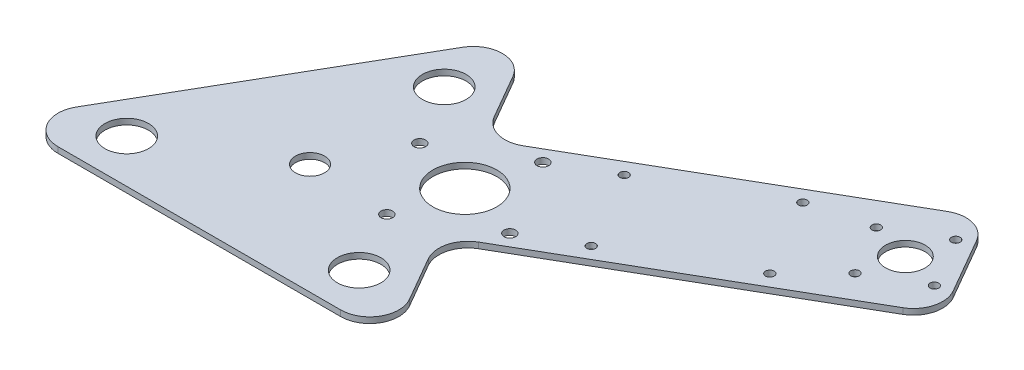
ISO-10303-21;
HEADER;
FILE_DESCRIPTION(('STEP AP214'),'2;1');
FILE_NAME('part.step','',(''),(''),'','','');
FILE_SCHEMA(('AUTOMOTIVE_DESIGN { 1 0 10303 214 1 1 1 1 }'));
ENDSEC;
DATA;
#1=APPLICATION_CONTEXT('core data for automotive mechanical design processes');
#2=APPLICATION_PROTOCOL_DEFINITION('international standard','automotive_design',2000,#1);
#3=PRODUCT_CONTEXT('',#1,'mechanical');
#4=PRODUCT('Part','Part','',(#3));
#5=PRODUCT_RELATED_PRODUCT_CATEGORY('part','',(#4));
#6=PRODUCT_DEFINITION_FORMATION('','',#4);
#7=PRODUCT_DEFINITION_CONTEXT('part definition',#1,'design');
#8=PRODUCT_DEFINITION('design','',#6,#7);
#9=PRODUCT_DEFINITION_SHAPE('','',#8);
#10=(LENGTH_UNIT() NAMED_UNIT(*) SI_UNIT(.MILLI.,.METRE.));
#11=(NAMED_UNIT(*) PLANE_ANGLE_UNIT() SI_UNIT($,.RADIAN.));
#12=(NAMED_UNIT(*) SI_UNIT($,.STERADIAN.) SOLID_ANGLE_UNIT());
#13=UNCERTAINTY_MEASURE_WITH_UNIT(LENGTH_MEASURE(1.E-05),#10,'distance_accuracy_value','');
#14=(GEOMETRIC_REPRESENTATION_CONTEXT(3) GLOBAL_UNCERTAINTY_ASSIGNED_CONTEXT((#13)) GLOBAL_UNIT_ASSIGNED_CONTEXT((#10,
#11,#12)) REPRESENTATION_CONTEXT('',''));
#15=CARTESIAN_POINT('',(0.,0.,0.));
#16=DIRECTION('',(0.,0.,1.));
#17=DIRECTION('',(1.,0.,0.));
#18=AXIS2_PLACEMENT_3D('',#15,#16,#17);
#19=CARTESIAN_POINT('',(65.9807621135332,2.,38.0940107675853));
#20=DIRECTION('',(-0.866025403784439,0.,0.5));
#21=DIRECTION('',(0.5,0.,0.866025403784439));
#22=AXIS2_PLACEMENT_3D('',#19,#20,#21);
#23=PLANE('',#22);
#24=DIRECTION('',(-0.5,0.,-0.866025403784439));
#25=VECTOR('',#24,1.);
#26=CARTESIAN_POINT('',(65.9807621135332,2.,38.0940107675853));
#27=LINE('',#26,#25);
#28=CARTESIAN_POINT('',(17.4903810567665,2.,-45.8937929011101));
#29=VERTEX_POINT('',#28);
#30=CARTESIAN_POINT('',(8.66025403784439,2.,-61.1880215351698));
#31=VERTEX_POINT('',#30);
#32=EDGE_CURVE('E200',#29,#31,#27,.T.);
#33=ORIENTED_EDGE('',*,*,#32,.F.);
#34=DIRECTION('',(0.,1.,0.));
#35=VECTOR('',#34,1.);
#36=CARTESIAN_POINT('',(17.4903810567665,2.,-45.89379290111));
#37=LINE('',#36,#35);
#38=CARTESIAN_POINT('',(17.4903810567665,0.,-45.8937929011101));
#39=VERTEX_POINT('',#38);
#40=EDGE_CURVE('E220',#29,#39,#37,.F.);
#41=ORIENTED_EDGE('',*,*,#40,.T.);
#42=DIRECTION('',(-0.5,0.,-0.866025403784439));
#43=VECTOR('',#42,1.);
#44=CARTESIAN_POINT('',(65.9807621135332,0.,38.0940107675853));
#45=LINE('',#44,#43);
#46=CARTESIAN_POINT('',(8.66025403784439,0.,-61.1880215351698));
#47=VERTEX_POINT('',#46);
#48=EDGE_CURVE('E189',#39,#47,#45,.T.);
#49=ORIENTED_EDGE('',*,*,#48,.T.);
#50=DIRECTION('',(0.,-1.,0.));
#51=VECTOR('',#50,1.);
#52=CARTESIAN_POINT('',(8.66025403784439,2.,-61.1880215351698));
#53=LINE('',#52,#51);
#54=EDGE_CURVE('E426',#47,#31,#53,.F.);
#55=ORIENTED_EDGE('',*,*,#54,.T.);
#56=EDGE_LOOP('',(#33,#41,#49,#55));
#57=FACE_BOUND('',#56,.T.);
#58=ADVANCED_FACE('F35',(#57),#23,.F.);
#59=CARTESIAN_POINT('',(0.,2.,0.));
#60=DIRECTION('',(0.,1.,0.));
#61=DIRECTION('',(0.,0.,1.));
#62=AXIS2_PLACEMENT_3D('',#59,#60,#61);
#63=PLANE('',#62);
#64=CARTESIAN_POINT('',(72.7019052838329,2.,-24.0766062413412));
#65=DIRECTION('',(0.,1.,0.));
#66=DIRECTION('',(0.,0.,1.));
#67=AXIS2_PLACEMENT_3D('',#64,#65,#66);
#68=CIRCLE('',#67,1.5);
#69=CARTESIAN_POINT('',(72.7019052838329,2.,-22.5766062413412));
#70=VERTEX_POINT('',#69);
#71=EDGE_CURVE('E248',#70,#70,#68,.T.);
#72=ORIENTED_EDGE('',*,*,#71,.F.);
#73=EDGE_LOOP('',(#72));
#74=FACE_BOUND('',#73,.T.);
#75=CARTESIAN_POINT('',(111.673048454133,2.,-46.5766062413412));
#76=DIRECTION('',(0.,1.,0.));
#77=DIRECTION('',(0.,0.,1.));
#78=AXIS2_PLACEMENT_3D('',#75,#76,#77);
#79=CIRCLE('',#78,1.5);
#80=CARTESIAN_POINT('',(111.673048454133,2.,-45.0766062413412));
#81=VERTEX_POINT('',#80);
#82=EDGE_CURVE('E556',#81,#81,#79,.T.);
#83=ORIENTED_EDGE('',*,*,#82,.F.);
#84=EDGE_LOOP('',(#83));
#85=FACE_BOUND('',#84,.T.);
#86=CARTESIAN_POINT('',(96.1730484541327,2.,-73.4233937586588));
#87=DIRECTION('',(0.,1.,0.));
#88=DIRECTION('',(0.,0.,1.));
#89=AXIS2_PLACEMENT_3D('',#86,#87,#88);
#90=CIRCLE('',#89,1.5);
#91=CARTESIAN_POINT('',(96.1730484541327,2.,-71.9233937586588));
#92=VERTEX_POINT('',#91);
#93=EDGE_CURVE('E262',#92,#92,#90,.T.);
#94=ORIENTED_EDGE('',*,*,#93,.F.);
#95=EDGE_LOOP('',(#94));
#96=FACE_BOUND('',#95,.T.);
#97=CARTESIAN_POINT('',(57.2019052838329,2.,-50.9233937586588));
#98=DIRECTION('',(0.,1.,0.));
#99=DIRECTION('',(0.,0.,1.));
#100=AXIS2_PLACEMENT_3D('',#97,#98,#99);
#101=CIRCLE('',#100,1.5);
#102=CARTESIAN_POINT('',(57.2019052838329,2.,-49.4233937586588));
#103=VERTEX_POINT('',#102);
#104=EDGE_CURVE('E244',#103,#103,#101,.T.);
#105=ORIENTED_EDGE('',*,*,#104,.F.);
#106=EDGE_LOOP('',(#105));
#107=FACE_BOUND('',#106,.T.);
#108=CARTESIAN_POINT('',(143.56406460551,2.,-71.3397459621556));
#109=DIRECTION('',(0.,1.,0.));
#110=DIRECTION('',(0.,0.,1.));
#111=AXIS2_PLACEMENT_3D('',#108,#109,#110);
#112=CIRCLE('',#111,1.5);
#113=CARTESIAN_POINT('',(143.56406460551,2.,-69.8397459621556));
#114=VERTEX_POINT('',#113);
#115=EDGE_CURVE('E274',#114,#114,#112,.T.);
#116=ORIENTED_EDGE('',*,*,#115,.F.);
#117=EDGE_LOOP('',(#116));
#118=FACE_BOUND('',#117,.T.);
#119=CARTESIAN_POINT('',(126.243556529821,2.,-61.3397459621556));
#120=DIRECTION('',(0.,1.,0.));
#121=DIRECTION('',(0.,0.,1.));
#122=AXIS2_PLACEMENT_3D('',#119,#120,#121);
#123=CIRCLE('',#122,1.5);
#124=CARTESIAN_POINT('',(126.243556529821,2.,-59.8397459621556));
#125=VERTEX_POINT('',#124);
#126=EDGE_CURVE('E280',#125,#125,#123,.T.);
#127=ORIENTED_EDGE('',*,*,#126,.F.);
#128=EDGE_LOOP('',(#127));
#129=FACE_BOUND('',#128,.T.);
#130=CARTESIAN_POINT('',(116.243556529821,2.,-78.6602540378444));
#131=DIRECTION('',(0.,1.,0.));
#132=DIRECTION('',(0.,0.,1.));
#133=AXIS2_PLACEMENT_3D('',#130,#131,#132);
#134=CIRCLE('',#133,1.5);
#135=CARTESIAN_POINT('',(116.243556529821,2.,-77.1602540378444));
#136=VERTEX_POINT('',#135);
#137=EDGE_CURVE('E243',#136,#136,#134,.T.);
#138=ORIENTED_EDGE('',*,*,#137,.F.);
#139=EDGE_LOOP('',(#138));
#140=FACE_BOUND('',#139,.T.);
#141=CARTESIAN_POINT('',(133.56406460551,2.,-88.6602540378444));
#142=DIRECTION('',(0.,1.,0.));
#143=DIRECTION('',(0.,0.,1.));
#144=AXIS2_PLACEMENT_3D('',#141,#142,#143);
#145=CIRCLE('',#144,1.5);
#146=CARTESIAN_POINT('',(133.56406460551,2.,-87.1602540378444));
#147=VERTEX_POINT('',#146);
#148=EDGE_CURVE('E296',#147,#147,#145,.T.);
#149=ORIENTED_EDGE('',*,*,#148,.F.);
#150=EDGE_LOOP('',(#149));
#151=FACE_BOUND('',#150,.T.);
#152=CARTESIAN_POINT('',(129.903810567666,2.,-75.));
#153=DIRECTION('',(0.,1.,0.));
#154=DIRECTION('',(0.,0.,1.));
#155=AXIS2_PLACEMENT_3D('',#152,#153,#154);
#156=CIRCLE('',#155,6.8);
#157=CARTESIAN_POINT('',(129.903810567666,2.,-68.2));
#158=VERTEX_POINT('',#157);
#159=EDGE_CURVE('E239',#158,#158,#156,.T.);
#160=ORIENTED_EDGE('',*,*,#159,.F.);
#161=EDGE_LOOP('',(#160));
#162=FACE_BOUND('',#161,.T.);
#163=CARTESIAN_POINT('',(39.4483845062519,2.,-40.6733937586588));
#164=DIRECTION('',(0.,1.,0.));
#165=DIRECTION('',(0.,0.,1.));
#166=AXIS2_PLACEMENT_3D('',#163,#164,#165);
#167=CIRCLE('',#166,2.);
#168=CARTESIAN_POINT('',(39.4483845062519,2.,-38.6733937586588));
#169=VERTEX_POINT('',#168);
#170=EDGE_CURVE('E306',#169,#169,#167,.T.);
#171=ORIENTED_EDGE('',*,*,#170,.F.);
#172=EDGE_LOOP('',(#171));
#173=FACE_BOUND('',#172,.T.);
#174=CARTESIAN_POINT('',(54.9483845062519,2.,-13.8266062413412));
#175=DIRECTION('',(0.,1.,0.));
#176=DIRECTION('',(0.,0.,1.));
#177=AXIS2_PLACEMENT_3D('',#174,#175,#176);
#178=CIRCLE('',#177,2.);
#179=CARTESIAN_POINT('',(54.9483845062519,2.,-11.8266062413412));
#180=VERTEX_POINT('',#179);
#181=EDGE_CURVE('E316',#180,#180,#178,.T.);
#182=ORIENTED_EDGE('',*,*,#181,.F.);
#183=EDGE_LOOP('',(#182));
#184=FACE_BOUND('',#183,.T.);
#185=CARTESIAN_POINT('',(28.1015969889343,2.,1.67339375865881));
#186=DIRECTION('',(0.,1.,0.));
#187=DIRECTION('',(0.,0.,1.));
#188=AXIS2_PLACEMENT_3D('',#185,#186,#187);
#189=CIRCLE('',#188,2.);
#190=CARTESIAN_POINT('',(28.1015969889343,2.,3.67339375865881));
#191=VERTEX_POINT('',#190);
#192=EDGE_CURVE('E322',#191,#191,#189,.T.);
#193=ORIENTED_EDGE('',*,*,#192,.F.);
#194=EDGE_LOOP('',(#193));
#195=FACE_BOUND('',#194,.T.);
#196=CARTESIAN_POINT('',(12.6015969889343,2.,-25.1733937586588));
#197=DIRECTION('',(0.,1.,0.));
#198=DIRECTION('',(0.,0.,1.));
#199=AXIS2_PLACEMENT_3D('',#196,#197,#198);
#200=CIRCLE('',#199,2.);
#201=CARTESIAN_POINT('',(12.6015969889343,2.,-23.1733937586588));
#202=VERTEX_POINT('',#201);
#203=EDGE_CURVE('E238',#202,#202,#200,.T.);
#204=ORIENTED_EDGE('',*,*,#203,.F.);
#205=EDGE_LOOP('',(#204));
#206=FACE_BOUND('',#205,.T.);
#207=CARTESIAN_POINT('',(33.7749907475931,2.,-19.5));
#208=DIRECTION('',(0.,1.,0.));
#209=DIRECTION('',(0.,0.,1.));
#210=AXIS2_PLACEMENT_3D('',#207,#208,#209);
#211=CIRCLE('',#210,11.);
#212=CARTESIAN_POINT('',(33.7749907475931,2.,-8.49999999999999));
#213=VERTEX_POINT('',#212);
#214=EDGE_CURVE('E305',#213,#213,#211,.T.);
#215=ORIENTED_EDGE('',*,*,#214,.F.);
#216=EDGE_LOOP('',(#215));
#217=FACE_BOUND('',#216,.T.);
#218=CARTESIAN_POINT('',(40.,2.,23.0940107675853));
#219=DIRECTION('',(0.,1.,0.));
#220=DIRECTION('',(0.,0.,1.));
#221=AXIS2_PLACEMENT_3D('',#218,#219,#220);
#222=CIRCLE('',#221,7.5);
#223=CARTESIAN_POINT('',(40.,2.,30.5940107675853));
#224=VERTEX_POINT('',#223);
#225=EDGE_CURVE('E374',#224,#224,#222,.T.);
#226=ORIENTED_EDGE('',*,*,#225,.F.);
#227=EDGE_LOOP('',(#226));
#228=FACE_BOUND('',#227,.T.);
#229=CARTESIAN_POINT('',(0.,2.,-46.1880215351698));
#230=DIRECTION('',(0.,1.,0.));
#231=DIRECTION('',(0.,0.,1.));
#232=AXIS2_PLACEMENT_3D('',#229,#230,#231);
#233=CIRCLE('',#232,7.5);
#234=CARTESIAN_POINT('',(0.,2.,-38.6880215351698));
#235=VERTEX_POINT('',#234);
#236=EDGE_CURVE('E192',#235,#235,#233,.T.);
#237=ORIENTED_EDGE('',*,*,#236,.F.);
#238=EDGE_LOOP('',(#237));
#239=FACE_BOUND('',#238,.T.);
#240=DIRECTION('',(-0.5,0.,-0.866025403784438));
#241=VECTOR('',#240,1.);
#242=CARTESIAN_POINT('',(153.394191624432,2.,-64.3134665205268));
#243=LINE('',#242,#241);
#244=CARTESIAN_POINT('',(148.394191624432,2.,-72.9737205583712));
#245=VERTEX_POINT('',#244);
#246=CARTESIAN_POINT('',(137.394191624432,2.,-92.0262794416288));
#247=VERTEX_POINT('',#246);
#248=EDGE_CURVE('E143',#245,#247,#243,.T.);
#249=ORIENTED_EDGE('',*,*,#248,.T.);
#250=CARTESIAN_POINT('',(128.733937586588,2.,-87.0262794416289));
#251=DIRECTION('',(0.,1.,0.));
#252=DIRECTION('',(0.,0.,1.));
#253=AXIS2_PLACEMENT_3D('',#250,#251,#252);
#254=CIRCLE('',#253,10.);
#255=CARTESIAN_POINT('',(123.733937586588,2.,-95.6865334794733));
#256=VERTEX_POINT('',#255);
#257=EDGE_CURVE('E149',#247,#256,#254,.T.);
#258=ORIENTED_EDGE('',*,*,#257,.T.);
#259=DIRECTION('',(-0.866025403784439,0.,0.5));
#260=VECTOR('',#259,1.);
#261=CARTESIAN_POINT('',(22.4903810567665,2.,-37.2335388632657));
#262=LINE('',#261,#260);
#263=CARTESIAN_POINT('',(31.1506350946109,2.,-42.2335388632657));
#264=VERTEX_POINT('',#263);
#265=EDGE_CURVE('E159',#256,#264,#262,.T.);
#266=ORIENTED_EDGE('',*,*,#265,.T.);
#267=CARTESIAN_POINT('',(26.1506350946109,2.,-50.89379290111));
#268=DIRECTION('',(0.,1.,0.));
#269=DIRECTION('',(0.,0.,1.));
#270=AXIS2_PLACEMENT_3D('',#267,#268,#269);
#271=CIRCLE('',#270,10.);
#272=EDGE_CURVE('E230',#264,#29,#271,.F.);
#273=ORIENTED_EDGE('',*,*,#272,.T.);
#274=ORIENTED_EDGE('',*,*,#32,.T.);
#275=CARTESIAN_POINT('',(0.,2.,-56.1880215351698));
#276=DIRECTION('',(0.,1.,0.));
#277=DIRECTION('',(0.,0.,1.));
#278=AXIS2_PLACEMENT_3D('',#275,#276,#277);
#279=CIRCLE('',#278,10.);
#280=CARTESIAN_POINT('',(-8.66025403784439,2.,-61.1880215351698));
#281=VERTEX_POINT('',#280);
#282=EDGE_CURVE('E150',#31,#281,#279,.T.);
#283=ORIENTED_EDGE('',*,*,#282,.T.);
#284=DIRECTION('',(-0.5,0.,0.866025403784439));
#285=VECTOR('',#284,1.);
#286=CARTESIAN_POINT('',(0.,2.,-76.1880215351698));
#287=LINE('',#286,#285);
#288=CARTESIAN_POINT('',(-57.3205080756888,2.,23.0940107675853));
#289=VERTEX_POINT('',#288);
#290=EDGE_CURVE('E167',#281,#289,#287,.T.);
#291=ORIENTED_EDGE('',*,*,#290,.T.);
#292=CARTESIAN_POINT('',(-48.6602540378444,2.,28.0940107675853));
#293=DIRECTION('',(0.,1.,0.));
#294=DIRECTION('',(0.,0.,1.));
#295=AXIS2_PLACEMENT_3D('',#292,#293,#294);
#296=CIRCLE('',#295,10.);
#297=CARTESIAN_POINT('',(-48.6602540378444,2.,38.0940107675853));
#298=VERTEX_POINT('',#297);
#299=EDGE_CURVE('E164',#289,#298,#296,.T.);
#300=ORIENTED_EDGE('',*,*,#299,.T.);
#301=DIRECTION('',(1.,0.,0.));
#302=VECTOR('',#301,1.);
#303=CARTESIAN_POINT('',(-65.9807621135332,2.,38.0940107675853));
#304=LINE('',#303,#302);
#305=CARTESIAN_POINT('',(48.6602540378444,2.,38.0940107675853));
#306=VERTEX_POINT('',#305);
#307=EDGE_CURVE('E162',#298,#306,#304,.T.);
#308=ORIENTED_EDGE('',*,*,#307,.T.);
#309=CARTESIAN_POINT('',(48.6602540378444,2.,28.0940107675853));
#310=DIRECTION('',(0.,1.,0.));
#311=DIRECTION('',(0.,0.,1.));
#312=AXIS2_PLACEMENT_3D('',#309,#310,#311);
#313=CIRCLE('',#312,10.);
#314=CARTESIAN_POINT('',(57.3205080756888,2.,23.0940107675853));
#315=VERTEX_POINT('',#314);
#316=EDGE_CURVE('E175',#306,#315,#313,.T.);
#317=ORIENTED_EDGE('',*,*,#316,.T.);
#318=CARTESIAN_POINT('',(48.4903810567665,2.,7.79978213352515));
#319=VERTEX_POINT('',#318);
#320=EDGE_CURVE('E393',#315,#319,#27,.T.);
#321=ORIENTED_EDGE('',*,*,#320,.T.);
#322=CARTESIAN_POINT('',(57.1506350946109,2.,2.79978213352515));
#323=DIRECTION('',(0.,1.,0.));
#324=DIRECTION('',(0.,0.,1.));
#325=AXIS2_PLACEMENT_3D('',#322,#323,#324);
#326=CIRCLE('',#325,10.);
#327=CARTESIAN_POINT('',(52.1506350946109,2.,-5.86047190431924));
#328=VERTEX_POINT('',#327);
#329=EDGE_CURVE('E44',#319,#328,#326,.F.);
#330=ORIENTED_EDGE('',*,*,#329,.T.);
#331=DIRECTION('',(0.866025403784439,0.,-0.5));
#332=VECTOR('',#331,1.);
#333=CARTESIAN_POINT('',(43.4903810567665,2.,-0.860471904319243));
#334=LINE('',#333,#332);
#335=CARTESIAN_POINT('',(144.733937586588,2.,-59.3134665205268));
#336=VERTEX_POINT('',#335);
#337=EDGE_CURVE('E144',#328,#336,#334,.T.);
#338=ORIENTED_EDGE('',*,*,#337,.T.);
#339=CARTESIAN_POINT('',(139.733937586588,2.,-67.9737205583712));
#340=DIRECTION('',(0.,1.,0.));
#341=DIRECTION('',(0.,0.,1.));
#342=AXIS2_PLACEMENT_3D('',#339,#340,#341);
#343=CIRCLE('',#342,10.);
#344=EDGE_CURVE('E139',#336,#245,#343,.T.);
#345=ORIENTED_EDGE('',*,*,#344,.T.);
#346=EDGE_LOOP('',(#249,#258,#266,#273,#274,#283,#291,#300,#308,#317,#321,#330,#338,#345));
#347=FACE_BOUND('',#346,.T.);
#348=CARTESIAN_POINT('',(-40.,2.,23.0940107675853));
#349=DIRECTION('',(0.,1.,0.));
#350=DIRECTION('',(0.,0.,1.));
#351=AXIS2_PLACEMENT_3D('',#348,#349,#350);
#352=CIRCLE('',#351,7.5);
#353=CARTESIAN_POINT('',(-40.,2.,30.5940107675853));
#354=VERTEX_POINT('',#353);
#355=EDGE_CURVE('E380',#354,#354,#352,.T.);
#356=ORIENTED_EDGE('',*,*,#355,.F.);
#357=EDGE_LOOP('',(#356));
#358=FACE_BOUND('',#357,.T.);
#359=CARTESIAN_POINT('',(0.,2.,0.));
#360=DIRECTION('',(0.,1.,0.));
#361=DIRECTION('',(0.,0.,1.));
#362=AXIS2_PLACEMENT_3D('',#359,#360,#361);
#363=CIRCLE('',#362,5.);
#364=CARTESIAN_POINT('',(0.,2.,5.));
#365=VERTEX_POINT('',#364);
#366=EDGE_CURVE('E368',#365,#365,#363,.T.);
#367=ORIENTED_EDGE('',*,*,#366,.F.);
#368=EDGE_LOOP('',(#367));
#369=FACE_BOUND('',#368,.T.);
#370=ADVANCED_FACE('F141',(#74,#85,#96,#107,#118,#129,#140,#151,#162,#173,#184,#195,#206,#217,
#228,#239,#347,#358,#369),#63,.T.);
#371=CARTESIAN_POINT('',(0.,0.,0.));
#372=DIRECTION('',(0.,1.,0.));
#373=DIRECTION('',(0.,0.,1.));
#374=AXIS2_PLACEMENT_3D('',#371,#372,#373);
#375=PLANE('',#374);
#376=CARTESIAN_POINT('',(72.7019052838329,0.,-24.0766062413412));
#377=DIRECTION('',(0.,1.,0.));
#378=DIRECTION('',(0.,0.,1.));
#379=AXIS2_PLACEMENT_3D('',#376,#377,#378);
#380=CIRCLE('',#379,1.5);
#381=CARTESIAN_POINT('',(72.7019052838329,0.,-22.5766062413412));
#382=VERTEX_POINT('',#381);
#383=EDGE_CURVE('E39',#382,#382,#380,.T.);
#384=ORIENTED_EDGE('',*,*,#383,.T.);
#385=EDGE_LOOP('',(#384));
#386=FACE_BOUND('',#385,.T.);
#387=CARTESIAN_POINT('',(111.673048454133,0.,-46.5766062413412));
#388=DIRECTION('',(0.,1.,0.));
#389=DIRECTION('',(0.,0.,1.));
#390=AXIS2_PLACEMENT_3D('',#387,#388,#389);
#391=CIRCLE('',#390,1.5);
#392=CARTESIAN_POINT('',(111.673048454133,0.,-45.0766062413412));
#393=VERTEX_POINT('',#392);
#394=EDGE_CURVE('E247',#393,#393,#391,.T.);
#395=ORIENTED_EDGE('',*,*,#394,.T.);
#396=EDGE_LOOP('',(#395));
#397=FACE_BOUND('',#396,.T.);
#398=CARTESIAN_POINT('',(96.1730484541327,0.,-73.4233937586588));
#399=DIRECTION('',(0.,1.,0.));
#400=DIRECTION('',(0.,0.,1.));
#401=AXIS2_PLACEMENT_3D('',#398,#399,#400);
#402=CIRCLE('',#401,1.5);
#403=CARTESIAN_POINT('',(96.1730484541327,0.,-71.9233937586588));
#404=VERTEX_POINT('',#403);
#405=EDGE_CURVE('E245',#404,#404,#402,.T.);
#406=ORIENTED_EDGE('',*,*,#405,.T.);
#407=EDGE_LOOP('',(#406));
#408=FACE_BOUND('',#407,.T.);
#409=CARTESIAN_POINT('',(57.2019052838329,0.,-50.9233937586588));
#410=DIRECTION('',(0.,1.,0.));
#411=DIRECTION('',(0.,0.,1.));
#412=AXIS2_PLACEMENT_3D('',#409,#410,#411);
#413=CIRCLE('',#412,1.5);
#414=CARTESIAN_POINT('',(57.2019052838329,0.,-49.4233937586588));
#415=VERTEX_POINT('',#414);
#416=EDGE_CURVE('E240',#415,#415,#413,.T.);
#417=ORIENTED_EDGE('',*,*,#416,.T.);
#418=EDGE_LOOP('',(#417));
#419=FACE_BOUND('',#418,.T.);
#420=CARTESIAN_POINT('',(143.56406460551,0.,-71.3397459621556));
#421=DIRECTION('',(0.,1.,0.));
#422=DIRECTION('',(0.,0.,1.));
#423=AXIS2_PLACEMENT_3D('',#420,#421,#422);
#424=CIRCLE('',#423,1.5);
#425=CARTESIAN_POINT('',(143.56406460551,0.,-69.8397459621556));
#426=VERTEX_POINT('',#425);
#427=EDGE_CURVE('E265',#426,#426,#424,.T.);
#428=ORIENTED_EDGE('',*,*,#427,.T.);
#429=EDGE_LOOP('',(#428));
#430=FACE_BOUND('',#429,.T.);
#431=CARTESIAN_POINT('',(126.243556529821,0.,-61.3397459621556));
#432=DIRECTION('',(0.,1.,0.));
#433=DIRECTION('',(0.,0.,1.));
#434=AXIS2_PLACEMENT_3D('',#431,#432,#433);
#435=CIRCLE('',#434,1.5);
#436=CARTESIAN_POINT('',(126.243556529821,0.,-59.8397459621556));
#437=VERTEX_POINT('',#436);
#438=EDGE_CURVE('E278',#437,#437,#435,.T.);
#439=ORIENTED_EDGE('',*,*,#438,.T.);
#440=EDGE_LOOP('',(#439));
#441=FACE_BOUND('',#440,.T.);
#442=CARTESIAN_POINT('',(116.243556529821,0.,-78.6602540378444));
#443=DIRECTION('',(0.,1.,0.));
#444=DIRECTION('',(0.,0.,1.));
#445=AXIS2_PLACEMENT_3D('',#442,#443,#444);
#446=CIRCLE('',#445,1.5);
#447=CARTESIAN_POINT('',(116.243556529821,0.,-77.1602540378444));
#448=VERTEX_POINT('',#447);
#449=EDGE_CURVE('E284',#448,#448,#446,.T.);
#450=ORIENTED_EDGE('',*,*,#449,.T.);
#451=EDGE_LOOP('',(#450));
#452=FACE_BOUND('',#451,.T.);
#453=CARTESIAN_POINT('',(133.56406460551,0.,-88.6602540378444));
#454=DIRECTION('',(0.,1.,0.));
#455=DIRECTION('',(0.,0.,1.));
#456=AXIS2_PLACEMENT_3D('',#453,#454,#455);
#457=CIRCLE('',#456,1.5);
#458=CARTESIAN_POINT('',(133.56406460551,0.,-87.1602540378444));
#459=VERTEX_POINT('',#458);
#460=EDGE_CURVE('E290',#459,#459,#457,.T.);
#461=ORIENTED_EDGE('',*,*,#460,.T.);
#462=EDGE_LOOP('',(#461));
#463=FACE_BOUND('',#462,.T.);
#464=CARTESIAN_POINT('',(129.903810567666,0.,-75.));
#465=DIRECTION('',(0.,1.,0.));
#466=DIRECTION('',(0.,0.,1.));
#467=AXIS2_PLACEMENT_3D('',#464,#465,#466);
#468=CIRCLE('',#467,6.8);
#469=CARTESIAN_POINT('',(129.903810567666,0.,-68.2));
#470=VERTEX_POINT('',#469);
#471=EDGE_CURVE('E235',#470,#470,#468,.T.);
#472=ORIENTED_EDGE('',*,*,#471,.T.);
#473=EDGE_LOOP('',(#472));
#474=FACE_BOUND('',#473,.T.);
#475=CARTESIAN_POINT('',(39.4483845062519,0.,-40.6733937586588));
#476=DIRECTION('',(0.,1.,0.));
#477=DIRECTION('',(0.,0.,1.));
#478=AXIS2_PLACEMENT_3D('',#475,#476,#477);
#479=CIRCLE('',#478,2.);
#480=CARTESIAN_POINT('',(39.4483845062519,0.,-38.6733937586588));
#481=VERTEX_POINT('',#480);
#482=EDGE_CURVE('E302',#481,#481,#479,.T.);
#483=ORIENTED_EDGE('',*,*,#482,.T.);
#484=EDGE_LOOP('',(#483));
#485=FACE_BOUND('',#484,.T.);
#486=CARTESIAN_POINT('',(54.9483845062519,0.,-13.8266062413412));
#487=DIRECTION('',(0.,1.,0.));
#488=DIRECTION('',(0.,0.,1.));
#489=AXIS2_PLACEMENT_3D('',#486,#487,#488);
#490=CIRCLE('',#489,2.);
#491=CARTESIAN_POINT('',(54.9483845062519,0.,-11.8266062413412));
#492=VERTEX_POINT('',#491);
#493=EDGE_CURVE('E310',#492,#492,#490,.T.);
#494=ORIENTED_EDGE('',*,*,#493,.T.);
#495=EDGE_LOOP('',(#494));
#496=FACE_BOUND('',#495,.T.);
#497=CARTESIAN_POINT('',(28.1015969889343,0.,1.67339375865881));
#498=DIRECTION('',(0.,1.,0.));
#499=DIRECTION('',(0.,0.,1.));
#500=AXIS2_PLACEMENT_3D('',#497,#498,#499);
#501=CIRCLE('',#500,2.);
#502=CARTESIAN_POINT('',(28.1015969889343,0.,3.67339375865881));
#503=VERTEX_POINT('',#502);
#504=EDGE_CURVE('E320',#503,#503,#501,.T.);
#505=ORIENTED_EDGE('',*,*,#504,.T.);
#506=EDGE_LOOP('',(#505));
#507=FACE_BOUND('',#506,.T.);
#508=CARTESIAN_POINT('',(12.6015969889343,0.,-25.1733937586588));
#509=DIRECTION('',(0.,1.,0.));
#510=DIRECTION('',(0.,0.,1.));
#511=AXIS2_PLACEMENT_3D('',#508,#509,#510);
#512=CIRCLE('',#511,2.);
#513=CARTESIAN_POINT('',(12.6015969889343,0.,-23.1733937586588));
#514=VERTEX_POINT('',#513);
#515=EDGE_CURVE('E326',#514,#514,#512,.T.);
#516=ORIENTED_EDGE('',*,*,#515,.T.);
#517=EDGE_LOOP('',(#516));
#518=FACE_BOUND('',#517,.T.);
#519=CARTESIAN_POINT('',(33.7749907475931,0.,-19.5));
#520=DIRECTION('',(0.,1.,0.));
#521=DIRECTION('',(0.,0.,1.));
#522=AXIS2_PLACEMENT_3D('',#519,#520,#521);
#523=CIRCLE('',#522,11.);
#524=CARTESIAN_POINT('',(33.7749907475931,0.,-8.49999999999999));
#525=VERTEX_POINT('',#524);
#526=EDGE_CURVE('E332',#525,#525,#523,.T.);
#527=ORIENTED_EDGE('',*,*,#526,.T.);
#528=EDGE_LOOP('',(#527));
#529=FACE_BOUND('',#528,.T.);
#530=DIRECTION('',(-0.866025403784439,0.,0.5));
#531=VECTOR('',#530,1.);
#532=CARTESIAN_POINT('',(22.4903810567665,0.,-37.2335388632657));
#533=LINE('',#532,#531);
#534=CARTESIAN_POINT('',(123.733937586588,0.,-95.6865334794733));
#535=VERTEX_POINT('',#534);
#536=CARTESIAN_POINT('',(31.1506350946109,0.,-42.2335388632657));
#537=VERTEX_POINT('',#536);
#538=EDGE_CURVE('E345',#535,#537,#533,.T.);
#539=ORIENTED_EDGE('',*,*,#538,.F.);
#540=CARTESIAN_POINT('',(128.733937586588,0.,-87.0262794416289));
#541=DIRECTION('',(0.,1.,0.));
#542=DIRECTION('',(0.,0.,1.));
#543=AXIS2_PLACEMENT_3D('',#540,#541,#542);
#544=CIRCLE('',#543,10.);
#545=CARTESIAN_POINT('',(137.394191624432,0.,-92.0262794416288));
#546=VERTEX_POINT('',#545);
#547=EDGE_CURVE('E421',#535,#546,#544,.F.);
#548=ORIENTED_EDGE('',*,*,#547,.T.);
#549=DIRECTION('',(-0.5,0.,-0.866025403784438));
#550=VECTOR('',#549,1.);
#551=CARTESIAN_POINT('',(153.394191624432,0.,-64.3134665205268));
#552=LINE('',#551,#550);
#553=CARTESIAN_POINT('',(148.394191624432,0.,-72.9737205583712));
#554=VERTEX_POINT('',#553);
#555=EDGE_CURVE('E343',#554,#546,#552,.T.);
#556=ORIENTED_EDGE('',*,*,#555,.F.);
#557=CARTESIAN_POINT('',(139.733937586588,0.,-67.9737205583712));
#558=DIRECTION('',(0.,1.,0.));
#559=DIRECTION('',(0.,0.,1.));
#560=AXIS2_PLACEMENT_3D('',#557,#558,#559);
#561=CIRCLE('',#560,10.);
#562=CARTESIAN_POINT('',(144.733937586588,0.,-59.3134665205268));
#563=VERTEX_POINT('',#562);
#564=EDGE_CURVE('E52',#554,#563,#561,.F.);
#565=ORIENTED_EDGE('',*,*,#564,.T.);
#566=DIRECTION('',(0.866025403784439,0.,-0.5));
#567=VECTOR('',#566,1.);
#568=CARTESIAN_POINT('',(43.4903810567665,0.,-0.860471904319243));
#569=LINE('',#568,#567);
#570=CARTESIAN_POINT('',(52.1506350946109,0.,-5.86047190431924));
#571=VERTEX_POINT('',#570);
#572=EDGE_CURVE('E341',#571,#563,#569,.T.);
#573=ORIENTED_EDGE('',*,*,#572,.F.);
#574=CARTESIAN_POINT('',(57.1506350946109,0.,2.79978213352515));
#575=DIRECTION('',(0.,1.,0.));
#576=DIRECTION('',(0.,0.,1.));
#577=AXIS2_PLACEMENT_3D('',#574,#575,#576);
#578=CIRCLE('',#577,10.);
#579=CARTESIAN_POINT('',(48.4903810567665,0.,7.79978213352515));
#580=VERTEX_POINT('',#579);
#581=EDGE_CURVE('E12',#571,#580,#578,.T.);
#582=ORIENTED_EDGE('',*,*,#581,.T.);
#583=CARTESIAN_POINT('',(57.3205080756888,0.,23.0940107675853));
#584=VERTEX_POINT('',#583);
#585=EDGE_CURVE('E191',#584,#580,#45,.T.);
#586=ORIENTED_EDGE('',*,*,#585,.F.);
#587=CARTESIAN_POINT('',(48.6602540378444,0.,28.0940107675853));
#588=DIRECTION('',(0.,1.,0.));
#589=DIRECTION('',(0.,0.,1.));
#590=AXIS2_PLACEMENT_3D('',#587,#588,#589);
#591=CIRCLE('',#590,10.);
#592=CARTESIAN_POINT('',(48.6602540378444,0.,38.0940107675853));
#593=VERTEX_POINT('',#592);
#594=EDGE_CURVE('E412',#584,#593,#591,.F.);
#595=ORIENTED_EDGE('',*,*,#594,.T.);
#596=DIRECTION('',(1.,0.,0.));
#597=VECTOR('',#596,1.);
#598=CARTESIAN_POINT('',(-65.9807621135332,0.,38.0940107675853));
#599=LINE('',#598,#597);
#600=CARTESIAN_POINT('',(-48.6602540378444,0.,38.0940107675853));
#601=VERTEX_POINT('',#600);
#602=EDGE_CURVE('E170',#601,#593,#599,.T.);
#603=ORIENTED_EDGE('',*,*,#602,.F.);
#604=CARTESIAN_POINT('',(-48.6602540378444,0.,28.0940107675853));
#605=DIRECTION('',(0.,1.,0.));
#606=DIRECTION('',(0.,0.,1.));
#607=AXIS2_PLACEMENT_3D('',#604,#605,#606);
#608=CIRCLE('',#607,10.);
#609=CARTESIAN_POINT('',(-57.3205080756888,0.,23.0940107675853));
#610=VERTEX_POINT('',#609);
#611=EDGE_CURVE('E404',#601,#610,#608,.F.);
#612=ORIENTED_EDGE('',*,*,#611,.T.);
#613=DIRECTION('',(-0.5,0.,0.866025403784439));
#614=VECTOR('',#613,1.);
#615=CARTESIAN_POINT('',(0.,0.,-76.1880215351698));
#616=LINE('',#615,#614);
#617=CARTESIAN_POINT('',(-8.66025403784439,0.,-61.1880215351698));
#618=VERTEX_POINT('',#617);
#619=EDGE_CURVE('E193',#618,#610,#616,.T.);
#620=ORIENTED_EDGE('',*,*,#619,.F.);
#621=CARTESIAN_POINT('',(0.,0.,-56.1880215351698));
#622=DIRECTION('',(0.,1.,0.));
#623=DIRECTION('',(0.,0.,1.));
#624=AXIS2_PLACEMENT_3D('',#621,#622,#623);
#625=CIRCLE('',#624,10.);
#626=EDGE_CURVE('E414',#618,#47,#625,.F.);
#627=ORIENTED_EDGE('',*,*,#626,.T.);
#628=ORIENTED_EDGE('',*,*,#48,.F.);
#629=CARTESIAN_POINT('',(26.1506350946109,0.,-50.89379290111));
#630=DIRECTION('',(0.,1.,0.));
#631=DIRECTION('',(0.,0.,1.));
#632=AXIS2_PLACEMENT_3D('',#629,#630,#631);
#633=CIRCLE('',#632,10.);
#634=EDGE_CURVE('E232',#39,#537,#633,.T.);
#635=ORIENTED_EDGE('',*,*,#634,.T.);
#636=EDGE_LOOP('',(#539,#548,#556,#565,#573,#582,#586,#595,#603,#612,#620,#627,#628,#635));
#637=FACE_BOUND('',#636,.T.);
#638=CARTESIAN_POINT('',(0.,0.,-46.1880215351698));
#639=DIRECTION('',(0.,1.,0.));
#640=DIRECTION('',(0.,0.,1.));
#641=AXIS2_PLACEMENT_3D('',#638,#639,#640);
#642=CIRCLE('',#641,7.5);
#643=CARTESIAN_POINT('',(0.,0.,-38.6880215351698));
#644=VERTEX_POINT('',#643);
#645=EDGE_CURVE('E384',#644,#644,#642,.T.);
#646=ORIENTED_EDGE('',*,*,#645,.T.);
#647=EDGE_LOOP('',(#646));
#648=FACE_BOUND('',#647,.T.);
#649=CARTESIAN_POINT('',(-40.,0.,23.0940107675853));
#650=DIRECTION('',(0.,1.,0.));
#651=DIRECTION('',(0.,0.,1.));
#652=AXIS2_PLACEMENT_3D('',#649,#650,#651);
#653=CIRCLE('',#652,7.5);
#654=CARTESIAN_POINT('',(-40.,0.,30.5940107675853));
#655=VERTEX_POINT('',#654);
#656=EDGE_CURVE('E378',#655,#655,#653,.T.);
#657=ORIENTED_EDGE('',*,*,#656,.T.);
#658=EDGE_LOOP('',(#657));
#659=FACE_BOUND('',#658,.T.);
#660=CARTESIAN_POINT('',(40.,0.,23.0940107675853));
#661=DIRECTION('',(0.,1.,0.));
#662=DIRECTION('',(0.,0.,1.));
#663=AXIS2_PLACEMENT_3D('',#660,#661,#662);
#664=CIRCLE('',#663,7.5);
#665=CARTESIAN_POINT('',(40.,0.,30.5940107675853));
#666=VERTEX_POINT('',#665);
#667=EDGE_CURVE('E372',#666,#666,#664,.T.);
#668=ORIENTED_EDGE('',*,*,#667,.T.);
#669=EDGE_LOOP('',(#668));
#670=FACE_BOUND('',#669,.T.);
#671=CARTESIAN_POINT('',(0.,0.,0.));
#672=DIRECTION('',(0.,1.,0.));
#673=DIRECTION('',(0.,0.,1.));
#674=AXIS2_PLACEMENT_3D('',#671,#672,#673);
#675=CIRCLE('',#674,5.);
#676=CARTESIAN_POINT('',(0.,0.,5.));
#677=VERTEX_POINT('',#676);
#678=EDGE_CURVE('E348',#677,#677,#675,.T.);
#679=ORIENTED_EDGE('',*,*,#678,.T.);
#680=EDGE_LOOP('',(#679));
#681=FACE_BOUND('',#680,.T.);
#682=ADVANCED_FACE('F410',(#386,#397,#408,#419,#430,#441,#452,#463,#474,#485,#496,#507,#518,
#529,#637,#648,#659,#670,#681),#375,.F.);
#683=ORIENTED_EDGE('',*,*,#585,.T.);
#684=DIRECTION('',(0.,1.,0.));
#685=VECTOR('',#684,1.);
#686=CARTESIAN_POINT('',(48.4903810567665,2.,7.79978213352515));
#687=LINE('',#686,#685);
#688=EDGE_CURVE('E209',#580,#319,#687,.T.);
#689=ORIENTED_EDGE('',*,*,#688,.T.);
#690=ORIENTED_EDGE('',*,*,#320,.F.);
#691=DIRECTION('',(0.,-1.,0.));
#692=VECTOR('',#691,1.);
#693=CARTESIAN_POINT('',(57.3205080756888,2.,23.0940107675853));
#694=LINE('',#693,#692);
#695=EDGE_CURVE('E212',#315,#584,#694,.T.);
#696=ORIENTED_EDGE('',*,*,#695,.T.);
#697=EDGE_LOOP('',(#683,#689,#690,#696));
#698=FACE_BOUND('',#697,.T.);
#699=ADVANCED_FACE('F207',(#698),#23,.F.);
#700=CARTESIAN_POINT('',(0.,2.,-76.1880215351698));
#701=DIRECTION('',(0.866025403784439,0.,0.5));
#702=DIRECTION('',(0.5,0.,-0.866025403784439));
#703=AXIS2_PLACEMENT_3D('',#700,#701,#702);
#704=PLANE('',#703);
#705=ORIENTED_EDGE('',*,*,#290,.F.);
#706=DIRECTION('',(0.,-1.,0.));
#707=VECTOR('',#706,1.);
#708=CARTESIAN_POINT('',(-8.66025403784439,2.,-61.1880215351698));
#709=LINE('',#708,#707);
#710=EDGE_CURVE('E218',#281,#618,#709,.T.);
#711=ORIENTED_EDGE('',*,*,#710,.T.);
#712=ORIENTED_EDGE('',*,*,#619,.T.);
#713=DIRECTION('',(0.,-1.,0.));
#714=VECTOR('',#713,1.);
#715=CARTESIAN_POINT('',(-57.3205080756888,2.,23.0940107675853));
#716=LINE('',#715,#714);
#717=EDGE_CURVE('E216',#610,#289,#716,.F.);
#718=ORIENTED_EDGE('',*,*,#717,.T.);
#719=EDGE_LOOP('',(#705,#711,#712,#718));
#720=FACE_BOUND('',#719,.T.);
#721=ADVANCED_FACE('F460',(#720),#704,.F.);
#722=CARTESIAN_POINT('',(-65.9807621135332,2.,38.0940107675853));
#723=DIRECTION('',(0.,0.,-1.));
#724=DIRECTION('',(-1.,0.,0.));
#725=AXIS2_PLACEMENT_3D('',#722,#723,#724);
#726=PLANE('',#725);
#727=ORIENTED_EDGE('',*,*,#602,.T.);
#728=DIRECTION('',(0.,-1.,0.));
#729=VECTOR('',#728,1.);
#730=CARTESIAN_POINT('',(48.6602540378444,2.,38.0940107675853));
#731=LINE('',#730,#729);
#732=EDGE_CURVE('E228',#593,#306,#731,.F.);
#733=ORIENTED_EDGE('',*,*,#732,.T.);
#734=ORIENTED_EDGE('',*,*,#307,.F.);
#735=DIRECTION('',(0.,-1.,0.));
#736=VECTOR('',#735,1.);
#737=CARTESIAN_POINT('',(-48.6602540378444,2.,38.0940107675853));
#738=LINE('',#737,#736);
#739=EDGE_CURVE('E225',#298,#601,#738,.T.);
#740=ORIENTED_EDGE('',*,*,#739,.T.);
#741=EDGE_LOOP('',(#727,#733,#734,#740));
#742=FACE_BOUND('',#741,.T.);
#743=ADVANCED_FACE('F407',(#742),#726,.F.);
#744=CARTESIAN_POINT('',(0.,2.,-46.1880215351698));
#745=DIRECTION('',(0.,-1.,0.));
#746=DIRECTION('',(0.,0.,-1.));
#747=AXIS2_PLACEMENT_3D('',#744,#745,#746);
#748=CYLINDRICAL_SURFACE('',#747,7.5);
#749=ORIENTED_EDGE('',*,*,#236,.T.);
#750=EDGE_LOOP('',(#749));
#751=FACE_BOUND('',#750,.T.);
#752=ORIENTED_EDGE('',*,*,#645,.F.);
#753=EDGE_LOOP('',(#752));
#754=FACE_BOUND('',#753,.T.);
#755=ADVANCED_FACE('F471',(#751,#754),#748,.F.);
#756=CARTESIAN_POINT('',(-40.,2.,23.0940107675853));
#757=DIRECTION('',(0.,-1.,0.));
#758=DIRECTION('',(0.,0.,-1.));
#759=AXIS2_PLACEMENT_3D('',#756,#757,#758);
#760=CYLINDRICAL_SURFACE('',#759,7.5);
#761=ORIENTED_EDGE('',*,*,#355,.T.);
#762=EDGE_LOOP('',(#761));
#763=FACE_BOUND('',#762,.T.);
#764=ORIENTED_EDGE('',*,*,#656,.F.);
#765=EDGE_LOOP('',(#764));
#766=FACE_BOUND('',#765,.T.);
#767=ADVANCED_FACE('F475',(#763,#766),#760,.F.);
#768=CARTESIAN_POINT('',(40.,2.,23.0940107675853));
#769=DIRECTION('',(0.,-1.,0.));
#770=DIRECTION('',(0.,0.,-1.));
#771=AXIS2_PLACEMENT_3D('',#768,#769,#770);
#772=CYLINDRICAL_SURFACE('',#771,7.5);
#773=ORIENTED_EDGE('',*,*,#225,.T.);
#774=EDGE_LOOP('',(#773));
#775=FACE_BOUND('',#774,.T.);
#776=ORIENTED_EDGE('',*,*,#667,.F.);
#777=EDGE_LOOP('',(#776));
#778=FACE_BOUND('',#777,.T.);
#779=ADVANCED_FACE('F480',(#775,#778),#772,.F.);
#780=CARTESIAN_POINT('',(0.,2.,0.));
#781=DIRECTION('',(0.,-1.,0.));
#782=DIRECTION('',(0.,0.,-1.));
#783=AXIS2_PLACEMENT_3D('',#780,#781,#782);
#784=CYLINDRICAL_SURFACE('',#783,5.);
#785=ORIENTED_EDGE('',*,*,#366,.T.);
#786=EDGE_LOOP('',(#785));
#787=FACE_BOUND('',#786,.T.);
#788=ORIENTED_EDGE('',*,*,#678,.F.);
#789=EDGE_LOOP('',(#788));
#790=FACE_BOUND('',#789,.T.);
#791=ADVANCED_FACE('F487',(#787,#790),#784,.F.);
#792=CARTESIAN_POINT('',(43.4903810567665,0.,-0.860471904319243));
#793=DIRECTION('',(0.5,0.,0.866025403784439));
#794=DIRECTION('',(0.866025403784439,0.,-0.5));
#795=AXIS2_PLACEMENT_3D('',#792,#793,#794);
#796=PLANE('',#795);
#797=ORIENTED_EDGE('',*,*,#572,.T.);
#798=DIRECTION('',(0.,1.,0.));
#799=VECTOR('',#798,1.);
#800=CARTESIAN_POINT('',(144.733937586588,0.,-59.3134665205268));
#801=LINE('',#800,#799);
#802=EDGE_CURVE('E424',#563,#336,#801,.T.);
#803=ORIENTED_EDGE('',*,*,#802,.T.);
#804=ORIENTED_EDGE('',*,*,#337,.F.);
#805=DIRECTION('',(0.,1.,0.));
#806=VECTOR('',#805,1.);
#807=CARTESIAN_POINT('',(52.1506350946109,0.,-5.86047190431924));
#808=LINE('',#807,#806);
#809=EDGE_CURVE('E59',#328,#571,#808,.F.);
#810=ORIENTED_EDGE('',*,*,#809,.T.);
#811=EDGE_LOOP('',(#797,#803,#804,#810));
#812=FACE_BOUND('',#811,.T.);
#813=ADVANCED_FACE('F491',(#812),#796,.T.);
#814=CARTESIAN_POINT('',(22.4903810567665,0.,-37.2335388632657));
#815=DIRECTION('',(-0.5,0.,-0.866025403784439));
#816=DIRECTION('',(-0.866025403784439,0.,0.5));
#817=AXIS2_PLACEMENT_3D('',#814,#815,#816);
#818=PLANE('',#817);
#819=ORIENTED_EDGE('',*,*,#265,.F.);
#820=DIRECTION('',(0.,1.,0.));
#821=VECTOR('',#820,1.);
#822=CARTESIAN_POINT('',(123.733937586588,0.,-95.6865334794732));
#823=LINE('',#822,#821);
#824=EDGE_CURVE('E417',#256,#535,#823,.F.);
#825=ORIENTED_EDGE('',*,*,#824,.T.);
#826=ORIENTED_EDGE('',*,*,#538,.T.);
#827=DIRECTION('',(0.,1.,0.));
#828=VECTOR('',#827,1.);
#829=CARTESIAN_POINT('',(31.1506350946109,0.,-42.2335388632657));
#830=LINE('',#829,#828);
#831=EDGE_CURVE('E360',#537,#264,#830,.T.);
#832=ORIENTED_EDGE('',*,*,#831,.T.);
#833=EDGE_LOOP('',(#819,#825,#826,#832));
#834=FACE_BOUND('',#833,.T.);
#835=ADVANCED_FACE('F439',(#834),#818,.T.);
#836=CARTESIAN_POINT('',(153.394191624432,0.,-64.3134665205268));
#837=DIRECTION('',(0.866025403784438,0.,-0.5));
#838=DIRECTION('',(-0.5,0.,-0.866025403784439));
#839=AXIS2_PLACEMENT_3D('',#836,#837,#838);
#840=PLANE('',#839);
#841=ORIENTED_EDGE('',*,*,#555,.T.);
#842=DIRECTION('',(0.,1.,0.));
#843=VECTOR('',#842,1.);
#844=CARTESIAN_POINT('',(137.394191624432,0.,-92.0262794416288));
#845=LINE('',#844,#843);
#846=EDGE_CURVE('E158',#546,#247,#845,.T.);
#847=ORIENTED_EDGE('',*,*,#846,.T.);
#848=ORIENTED_EDGE('',*,*,#248,.F.);
#849=DIRECTION('',(0.,1.,0.));
#850=VECTOR('',#849,1.);
#851=CARTESIAN_POINT('',(148.394191624432,0.,-72.9737205583712));
#852=LINE('',#851,#850);
#853=EDGE_CURVE('E156',#245,#554,#852,.F.);
#854=ORIENTED_EDGE('',*,*,#853,.T.);
#855=EDGE_LOOP('',(#841,#847,#848,#854));
#856=FACE_BOUND('',#855,.T.);
#857=ADVANCED_FACE('F155',(#856),#840,.T.);
#858=CARTESIAN_POINT('',(128.733937586588,0.,-87.0262794416289));
#859=DIRECTION('',(0.,1.,0.));
#860=DIRECTION('',(0.,0.,1.));
#861=AXIS2_PLACEMENT_3D('',#858,#859,#860);
#862=CYLINDRICAL_SURFACE('',#861,10.);
#863=ORIENTED_EDGE('',*,*,#547,.F.);
#864=ORIENTED_EDGE('',*,*,#824,.F.);
#865=ORIENTED_EDGE('',*,*,#257,.F.);
#866=ORIENTED_EDGE('',*,*,#846,.F.);
#867=EDGE_LOOP('',(#863,#864,#865,#866));
#868=FACE_BOUND('',#867,.T.);
#869=ADVANCED_FACE('F442',(#868),#862,.T.);
#870=CARTESIAN_POINT('',(139.733937586588,0.,-67.9737205583712));
#871=DIRECTION('',(0.,1.,0.));
#872=DIRECTION('',(0.,0.,1.));
#873=AXIS2_PLACEMENT_3D('',#870,#871,#872);
#874=CYLINDRICAL_SURFACE('',#873,10.);
#875=ORIENTED_EDGE('',*,*,#564,.F.);
#876=ORIENTED_EDGE('',*,*,#853,.F.);
#877=ORIENTED_EDGE('',*,*,#344,.F.);
#878=ORIENTED_EDGE('',*,*,#802,.F.);
#879=EDGE_LOOP('',(#875,#876,#877,#878));
#880=FACE_BOUND('',#879,.T.);
#881=ADVANCED_FACE('F161',(#880),#874,.T.);
#882=CARTESIAN_POINT('',(26.1506350946109,0.,-50.89379290111));
#883=DIRECTION('',(0.,1.,0.));
#884=DIRECTION('',(0.,0.,1.));
#885=AXIS2_PLACEMENT_3D('',#882,#883,#884);
#886=CYLINDRICAL_SURFACE('',#885,10.);
#887=ORIENTED_EDGE('',*,*,#634,.F.);
#888=ORIENTED_EDGE('',*,*,#40,.F.);
#889=ORIENTED_EDGE('',*,*,#272,.F.);
#890=ORIENTED_EDGE('',*,*,#831,.F.);
#891=EDGE_LOOP('',(#887,#888,#889,#890));
#892=FACE_BOUND('',#891,.T.);
#893=ADVANCED_FACE('F434',(#892),#886,.F.);
#894=CARTESIAN_POINT('',(57.1506350946109,2.,2.79978213352515));
#895=DIRECTION('',(0.,1.,0.));
#896=DIRECTION('',(0.,0.,1.));
#897=AXIS2_PLACEMENT_3D('',#894,#895,#896);
#898=CYLINDRICAL_SURFACE('',#897,10.);
#899=ORIENTED_EDGE('',*,*,#581,.F.);
#900=ORIENTED_EDGE('',*,*,#809,.F.);
#901=ORIENTED_EDGE('',*,*,#329,.F.);
#902=ORIENTED_EDGE('',*,*,#688,.F.);
#903=EDGE_LOOP('',(#899,#900,#901,#902));
#904=FACE_BOUND('',#903,.T.);
#905=ADVANCED_FACE('F215',(#904),#898,.F.);
#906=CARTESIAN_POINT('',(0.,2.,-56.1880215351698));
#907=DIRECTION('',(0.,-1.,0.));
#908=DIRECTION('',(0.,0.,-1.));
#909=AXIS2_PLACEMENT_3D('',#906,#907,#908);
#910=CYLINDRICAL_SURFACE('',#909,10.);
#911=ORIENTED_EDGE('',*,*,#282,.F.);
#912=ORIENTED_EDGE('',*,*,#54,.F.);
#913=ORIENTED_EDGE('',*,*,#626,.F.);
#914=ORIENTED_EDGE('',*,*,#710,.F.);
#915=EDGE_LOOP('',(#911,#912,#913,#914));
#916=FACE_BOUND('',#915,.T.);
#917=ADVANCED_FACE('F704',(#916),#910,.T.);
#918=CARTESIAN_POINT('',(48.6602540378444,2.,28.0940107675853));
#919=DIRECTION('',(0.,-1.,0.));
#920=DIRECTION('',(0.,0.,-1.));
#921=AXIS2_PLACEMENT_3D('',#918,#919,#920);
#922=CYLINDRICAL_SURFACE('',#921,10.);
#923=ORIENTED_EDGE('',*,*,#316,.F.);
#924=ORIENTED_EDGE('',*,*,#732,.F.);
#925=ORIENTED_EDGE('',*,*,#594,.F.);
#926=ORIENTED_EDGE('',*,*,#695,.F.);
#927=EDGE_LOOP('',(#923,#924,#925,#926));
#928=FACE_BOUND('',#927,.T.);
#929=ADVANCED_FACE('F698',(#928),#922,.T.);
#930=CARTESIAN_POINT('',(-48.6602540378444,2.,28.0940107675853));
#931=DIRECTION('',(0.,-1.,0.));
#932=DIRECTION('',(0.,0.,-1.));
#933=AXIS2_PLACEMENT_3D('',#930,#931,#932);
#934=CYLINDRICAL_SURFACE('',#933,10.);
#935=ORIENTED_EDGE('',*,*,#299,.F.);
#936=ORIENTED_EDGE('',*,*,#717,.F.);
#937=ORIENTED_EDGE('',*,*,#611,.F.);
#938=ORIENTED_EDGE('',*,*,#739,.F.);
#939=EDGE_LOOP('',(#935,#936,#937,#938));
#940=FACE_BOUND('',#939,.T.);
#941=ADVANCED_FACE('F37',(#940),#934,.T.);
#942=CARTESIAN_POINT('',(33.7749907475931,0.,-19.5));
#943=DIRECTION('',(0.,1.,0.));
#944=DIRECTION('',(0.,0.,1.));
#945=AXIS2_PLACEMENT_3D('',#942,#943,#944);
#946=CYLINDRICAL_SURFACE('',#945,11.);
#947=ORIENTED_EDGE('',*,*,#526,.F.);
#948=EDGE_LOOP('',(#947));
#949=FACE_BOUND('',#948,.T.);
#950=ORIENTED_EDGE('',*,*,#214,.T.);
#951=EDGE_LOOP('',(#950));
#952=FACE_BOUND('',#951,.T.);
#953=ADVANCED_FACE('F497',(#949,#952),#946,.F.);
#954=CARTESIAN_POINT('',(12.6015969889343,0.,-25.1733937586588));
#955=DIRECTION('',(0.,1.,0.));
#956=DIRECTION('',(0.,0.,1.));
#957=AXIS2_PLACEMENT_3D('',#954,#955,#956);
#958=CYLINDRICAL_SURFACE('',#957,2.);
#959=ORIENTED_EDGE('',*,*,#515,.F.);
#960=EDGE_LOOP('',(#959));
#961=FACE_BOUND('',#960,.T.);
#962=ORIENTED_EDGE('',*,*,#203,.T.);
#963=EDGE_LOOP('',(#962));
#964=FACE_BOUND('',#963,.T.);
#965=ADVANCED_FACE('F500',(#961,#964),#958,.F.);
#966=CARTESIAN_POINT('',(28.1015969889343,0.,1.67339375865881));
#967=DIRECTION('',(0.,1.,0.));
#968=DIRECTION('',(0.,0.,1.));
#969=AXIS2_PLACEMENT_3D('',#966,#967,#968);
#970=CYLINDRICAL_SURFACE('',#969,2.);
#971=ORIENTED_EDGE('',*,*,#504,.F.);
#972=EDGE_LOOP('',(#971));
#973=FACE_BOUND('',#972,.T.);
#974=ORIENTED_EDGE('',*,*,#192,.T.);
#975=EDGE_LOOP('',(#974));
#976=FACE_BOUND('',#975,.T.);
#977=ADVANCED_FACE('F504',(#973,#976),#970,.F.);
#978=CARTESIAN_POINT('',(54.9483845062519,0.,-13.8266062413412));
#979=DIRECTION('',(0.,1.,0.));
#980=DIRECTION('',(0.,0.,1.));
#981=AXIS2_PLACEMENT_3D('',#978,#979,#980);
#982=CYLINDRICAL_SURFACE('',#981,2.);
#983=ORIENTED_EDGE('',*,*,#493,.F.);
#984=EDGE_LOOP('',(#983));
#985=FACE_BOUND('',#984,.T.);
#986=ORIENTED_EDGE('',*,*,#181,.T.);
#987=EDGE_LOOP('',(#986));
#988=FACE_BOUND('',#987,.T.);
#989=ADVANCED_FACE('F508',(#985,#988),#982,.F.);
#990=CARTESIAN_POINT('',(39.4483845062519,0.,-40.6733937586588));
#991=DIRECTION('',(0.,1.,0.));
#992=DIRECTION('',(0.,0.,1.));
#993=AXIS2_PLACEMENT_3D('',#990,#991,#992);
#994=CYLINDRICAL_SURFACE('',#993,2.);
#995=ORIENTED_EDGE('',*,*,#482,.F.);
#996=EDGE_LOOP('',(#995));
#997=FACE_BOUND('',#996,.T.);
#998=ORIENTED_EDGE('',*,*,#170,.T.);
#999=EDGE_LOOP('',(#998));
#1000=FACE_BOUND('',#999,.T.);
#1001=ADVANCED_FACE('F512',(#997,#1000),#994,.F.);
#1002=CARTESIAN_POINT('',(129.903810567666,-8.,-75.));
#1003=DIRECTION('',(0.,1.,0.));
#1004=DIRECTION('',(0.,0.,1.));
#1005=AXIS2_PLACEMENT_3D('',#1002,#1003,#1004);
#1006=CYLINDRICAL_SURFACE('',#1005,6.8);
#1007=ORIENTED_EDGE('',*,*,#159,.T.);
#1008=EDGE_LOOP('',(#1007));
#1009=FACE_BOUND('',#1008,.T.);
#1010=ORIENTED_EDGE('',*,*,#471,.F.);
#1011=EDGE_LOOP('',(#1010));
#1012=FACE_BOUND('',#1011,.T.);
#1013=ADVANCED_FACE('F516',(#1009,#1012),#1006,.F.);
#1014=CARTESIAN_POINT('',(133.56406460551,0.,-88.6602540378444));
#1015=DIRECTION('',(0.,1.,0.));
#1016=DIRECTION('',(0.,0.,1.));
#1017=AXIS2_PLACEMENT_3D('',#1014,#1015,#1016);
#1018=CYLINDRICAL_SURFACE('',#1017,1.5);
#1019=ORIENTED_EDGE('',*,*,#460,.F.);
#1020=EDGE_LOOP('',(#1019));
#1021=FACE_BOUND('',#1020,.T.);
#1022=ORIENTED_EDGE('',*,*,#148,.T.);
#1023=EDGE_LOOP('',(#1022));
#1024=FACE_BOUND('',#1023,.T.);
#1025=ADVANCED_FACE('F520',(#1021,#1024),#1018,.F.);
#1026=CARTESIAN_POINT('',(116.243556529821,0.,-78.6602540378444));
#1027=DIRECTION('',(0.,1.,0.));
#1028=DIRECTION('',(0.,0.,1.));
#1029=AXIS2_PLACEMENT_3D('',#1026,#1027,#1028);
#1030=CYLINDRICAL_SURFACE('',#1029,1.5);
#1031=ORIENTED_EDGE('',*,*,#449,.F.);
#1032=EDGE_LOOP('',(#1031));
#1033=FACE_BOUND('',#1032,.T.);
#1034=ORIENTED_EDGE('',*,*,#137,.T.);
#1035=EDGE_LOOP('',(#1034));
#1036=FACE_BOUND('',#1035,.T.);
#1037=ADVANCED_FACE('F524',(#1033,#1036),#1030,.F.);
#1038=CARTESIAN_POINT('',(126.243556529821,0.,-61.3397459621556));
#1039=DIRECTION('',(0.,1.,0.));
#1040=DIRECTION('',(0.,0.,1.));
#1041=AXIS2_PLACEMENT_3D('',#1038,#1039,#1040);
#1042=CYLINDRICAL_SURFACE('',#1041,1.5);
#1043=ORIENTED_EDGE('',*,*,#438,.F.);
#1044=EDGE_LOOP('',(#1043));
#1045=FACE_BOUND('',#1044,.T.);
#1046=ORIENTED_EDGE('',*,*,#126,.T.);
#1047=EDGE_LOOP('',(#1046));
#1048=FACE_BOUND('',#1047,.T.);
#1049=ADVANCED_FACE('F528',(#1045,#1048),#1042,.F.);
#1050=CARTESIAN_POINT('',(143.56406460551,0.,-71.3397459621556));
#1051=DIRECTION('',(0.,1.,0.));
#1052=DIRECTION('',(0.,0.,1.));
#1053=AXIS2_PLACEMENT_3D('',#1050,#1051,#1052);
#1054=CYLINDRICAL_SURFACE('',#1053,1.5);
#1055=ORIENTED_EDGE('',*,*,#427,.F.);
#1056=EDGE_LOOP('',(#1055));
#1057=FACE_BOUND('',#1056,.T.);
#1058=ORIENTED_EDGE('',*,*,#115,.T.);
#1059=EDGE_LOOP('',(#1058));
#1060=FACE_BOUND('',#1059,.T.);
#1061=ADVANCED_FACE('F532',(#1057,#1060),#1054,.F.);
#1062=CARTESIAN_POINT('',(57.2019052838329,-8.,-50.9233937586588));
#1063=DIRECTION('',(0.,1.,0.));
#1064=DIRECTION('',(0.,0.,1.));
#1065=AXIS2_PLACEMENT_3D('',#1062,#1063,#1064);
#1066=CYLINDRICAL_SURFACE('',#1065,1.5);
#1067=ORIENTED_EDGE('',*,*,#104,.T.);
#1068=EDGE_LOOP('',(#1067));
#1069=FACE_BOUND('',#1068,.T.);
#1070=ORIENTED_EDGE('',*,*,#416,.F.);
#1071=EDGE_LOOP('',(#1070));
#1072=FACE_BOUND('',#1071,.T.);
#1073=ADVANCED_FACE('F536',(#1069,#1072),#1066,.F.);
#1074=CARTESIAN_POINT('',(96.1730484541327,-8.,-73.4233937586588));
#1075=DIRECTION('',(0.,1.,0.));
#1076=DIRECTION('',(0.,0.,1.));
#1077=AXIS2_PLACEMENT_3D('',#1074,#1075,#1076);
#1078=CYLINDRICAL_SURFACE('',#1077,1.5);
#1079=ORIENTED_EDGE('',*,*,#93,.T.);
#1080=EDGE_LOOP('',(#1079));
#1081=FACE_BOUND('',#1080,.T.);
#1082=ORIENTED_EDGE('',*,*,#405,.F.);
#1083=EDGE_LOOP('',(#1082));
#1084=FACE_BOUND('',#1083,.T.);
#1085=ADVANCED_FACE('F540',(#1081,#1084),#1078,.F.);
#1086=CARTESIAN_POINT('',(111.673048454133,-8.,-46.5766062413412));
#1087=DIRECTION('',(0.,1.,0.));
#1088=DIRECTION('',(0.,0.,1.));
#1089=AXIS2_PLACEMENT_3D('',#1086,#1087,#1088);
#1090=CYLINDRICAL_SURFACE('',#1089,1.5);
#1091=ORIENTED_EDGE('',*,*,#82,.T.);
#1092=EDGE_LOOP('',(#1091));
#1093=FACE_BOUND('',#1092,.T.);
#1094=ORIENTED_EDGE('',*,*,#394,.F.);
#1095=EDGE_LOOP('',(#1094));
#1096=FACE_BOUND('',#1095,.T.);
#1097=ADVANCED_FACE('F543',(#1093,#1096),#1090,.F.);
#1098=CARTESIAN_POINT('',(72.7019052838329,-8.,-24.0766062413412));
#1099=DIRECTION('',(0.,1.,0.));
#1100=DIRECTION('',(0.,0.,1.));
#1101=AXIS2_PLACEMENT_3D('',#1098,#1099,#1100);
#1102=CYLINDRICAL_SURFACE('',#1101,1.5);
#1103=ORIENTED_EDGE('',*,*,#71,.T.);
#1104=EDGE_LOOP('',(#1103));
#1105=FACE_BOUND('',#1104,.T.);
#1106=ORIENTED_EDGE('',*,*,#383,.F.);
#1107=EDGE_LOOP('',(#1106));
#1108=FACE_BOUND('',#1107,.T.);
#1109=ADVANCED_FACE('F547',(#1105,#1108),#1102,.F.);
#1110=CLOSED_SHELL('',(#58,#370,#682,#699,#721,#743,#755,#767,#779,#791,#813,#835,#857,#869,
#881,#893,#905,#917,#929,#941,#953,#965,#977,#989,#1001,#1013,#1025,#1037,#1049,#1061,#1073,
#1085,#1097,#1109));
#1111=MANIFOLD_SOLID_BREP('B2',#1110);
#1112=ADVANCED_BREP_SHAPE_REPRESENTATION('',(#18,#1111),#14);
#1113=SHAPE_DEFINITION_REPRESENTATION(#9,#1112);
ENDSEC;
END-ISO-10303-21;
